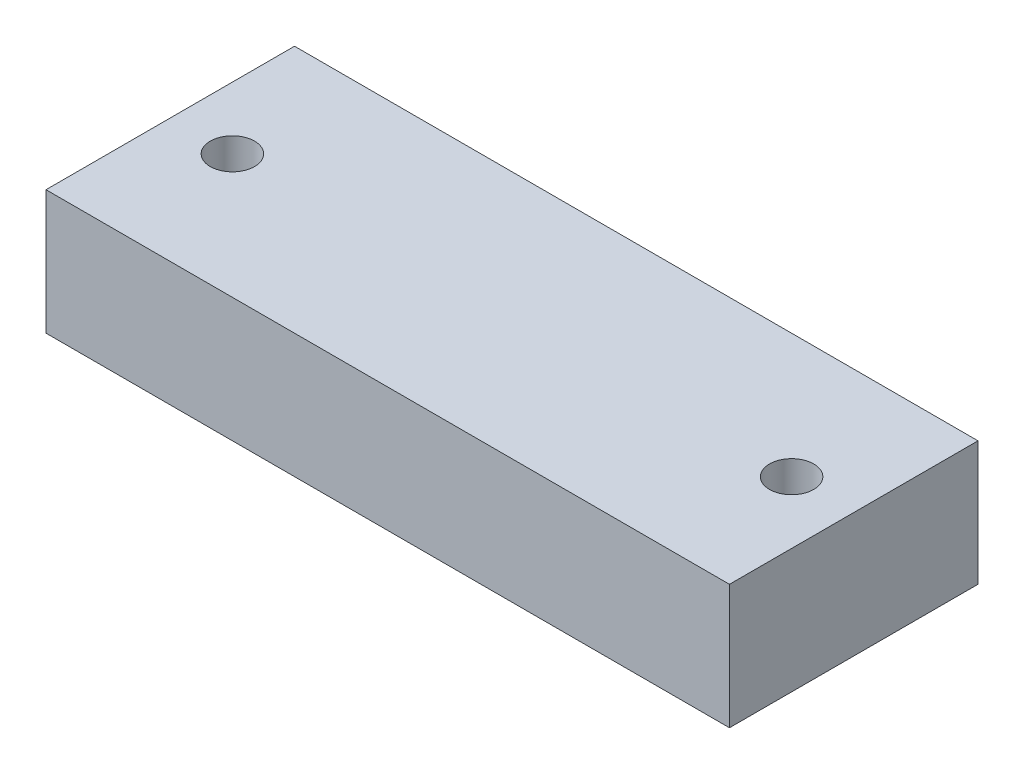
ISO-10303-21;
HEADER;
FILE_DESCRIPTION(('STEP AP214'),'2;1');
FILE_NAME('part.step','',(''),(''),'','','');
FILE_SCHEMA(('AUTOMOTIVE_DESIGN { 1 0 10303 214 1 1 1 1 }'));
ENDSEC;
DATA;
#1=APPLICATION_CONTEXT('core data for automotive mechanical design processes');
#2=APPLICATION_PROTOCOL_DEFINITION('international standard','automotive_design',2000,#1);
#3=PRODUCT_CONTEXT('',#1,'mechanical');
#4=PRODUCT('Part','Part','',(#3));
#5=PRODUCT_RELATED_PRODUCT_CATEGORY('part','',(#4));
#6=PRODUCT_DEFINITION_FORMATION('','',#4);
#7=PRODUCT_DEFINITION_CONTEXT('part definition',#1,'design');
#8=PRODUCT_DEFINITION('design','',#6,#7);
#9=PRODUCT_DEFINITION_SHAPE('','',#8);
#10=(LENGTH_UNIT() NAMED_UNIT(*) SI_UNIT(.MILLI.,.METRE.));
#11=(NAMED_UNIT(*) PLANE_ANGLE_UNIT() SI_UNIT($,.RADIAN.));
#12=(NAMED_UNIT(*) SI_UNIT($,.STERADIAN.) SOLID_ANGLE_UNIT());
#13=UNCERTAINTY_MEASURE_WITH_UNIT(LENGTH_MEASURE(1.E-05),#10,'distance_accuracy_value','');
#14=(GEOMETRIC_REPRESENTATION_CONTEXT(3) GLOBAL_UNCERTAINTY_ASSIGNED_CONTEXT((#13)) GLOBAL_UNIT_ASSIGNED_CONTEXT((#10,
#11,#12)) REPRESENTATION_CONTEXT('',''));
#15=CARTESIAN_POINT('',(0.,0.,0.));
#16=DIRECTION('',(0.,0.,1.));
#17=DIRECTION('',(1.,0.,0.));
#18=AXIS2_PLACEMENT_3D('',#15,#16,#17);
#19=CARTESIAN_POINT('',(17.4625,6.35,-6.35));
#20=DIRECTION('',(-1.,0.,0.));
#21=DIRECTION('',(0.,0.,1.));
#22=AXIS2_PLACEMENT_3D('',#19,#20,#21);
#23=PLANE('',#22);
#24=DIRECTION('',(0.,0.,-1.));
#25=VECTOR('',#24,1.);
#26=CARTESIAN_POINT('',(17.4625,0.,-6.35));
#27=LINE('',#26,#25);
#28=CARTESIAN_POINT('',(17.4625,0.,6.35));
#29=VERTEX_POINT('',#28);
#30=CARTESIAN_POINT('',(17.4625,0.,-6.35));
#31=VERTEX_POINT('',#30);
#32=EDGE_CURVE('E109',#29,#31,#27,.T.);
#33=ORIENTED_EDGE('',*,*,#32,.T.);
#34=DIRECTION('',(0.,-1.,0.));
#35=VECTOR('',#34,1.);
#36=CARTESIAN_POINT('',(17.4625,6.35,-6.35));
#37=LINE('',#36,#35);
#38=CARTESIAN_POINT('',(17.4625,6.35,-6.35));
#39=VERTEX_POINT('',#38);
#40=EDGE_CURVE('E11',#39,#31,#37,.T.);
#41=ORIENTED_EDGE('',*,*,#40,.F.);
#42=DIRECTION('',(0.,0.,-1.));
#43=VECTOR('',#42,1.);
#44=CARTESIAN_POINT('',(17.4625,6.35,-6.35));
#45=LINE('',#44,#43);
#46=CARTESIAN_POINT('',(17.4625,6.35,6.35));
#47=VERTEX_POINT('',#46);
#48=EDGE_CURVE('E93',#47,#39,#45,.T.);
#49=ORIENTED_EDGE('',*,*,#48,.F.);
#50=DIRECTION('',(0.,-1.,0.));
#51=VECTOR('',#50,1.);
#52=CARTESIAN_POINT('',(17.4625,6.35,6.35));
#53=LINE('',#52,#51);
#54=EDGE_CURVE('E105',#47,#29,#53,.T.);
#55=ORIENTED_EDGE('',*,*,#54,.T.);
#56=EDGE_LOOP('',(#33,#41,#49,#55));
#57=FACE_BOUND('',#56,.T.);
#58=ADVANCED_FACE('F41',(#57),#23,.F.);
#59=CARTESIAN_POINT('',(-17.4625,6.35,-6.35));
#60=DIRECTION('',(0.,0.,1.));
#61=DIRECTION('',(1.,0.,0.));
#62=AXIS2_PLACEMENT_3D('',#59,#60,#61);
#63=PLANE('',#62);
#64=DIRECTION('',(-1.,0.,0.));
#65=VECTOR('',#64,1.);
#66=CARTESIAN_POINT('',(-17.4625,0.,-6.35));
#67=LINE('',#66,#65);
#68=CARTESIAN_POINT('',(-17.4625,0.,-6.35));
#69=VERTEX_POINT('',#68);
#70=EDGE_CURVE('E98',#31,#69,#67,.T.);
#71=ORIENTED_EDGE('',*,*,#70,.T.);
#72=DIRECTION('',(0.,-1.,0.));
#73=VECTOR('',#72,1.);
#74=CARTESIAN_POINT('',(-17.4625,6.35,-6.35));
#75=LINE('',#74,#73);
#76=CARTESIAN_POINT('',(-17.4625,6.35,-6.35));
#77=VERTEX_POINT('',#76);
#78=EDGE_CURVE('E50',#77,#69,#75,.T.);
#79=ORIENTED_EDGE('',*,*,#78,.F.);
#80=DIRECTION('',(-1.,0.,0.));
#81=VECTOR('',#80,1.);
#82=CARTESIAN_POINT('',(-17.4625,6.35,-6.35));
#83=LINE('',#82,#81);
#84=EDGE_CURVE('E88',#39,#77,#83,.T.);
#85=ORIENTED_EDGE('',*,*,#84,.F.);
#86=ORIENTED_EDGE('',*,*,#40,.T.);
#87=EDGE_LOOP('',(#71,#79,#85,#86));
#88=FACE_BOUND('',#87,.T.);
#89=ADVANCED_FACE('F97',(#88),#63,.F.);
#90=CARTESIAN_POINT('',(-17.4625,6.35,-6.35));
#91=DIRECTION('',(1.,0.,0.));
#92=DIRECTION('',(0.,0.,-1.));
#93=AXIS2_PLACEMENT_3D('',#90,#91,#92);
#94=PLANE('',#93);
#95=DIRECTION('',(0.,0.,1.));
#96=VECTOR('',#95,1.);
#97=CARTESIAN_POINT('',(-17.4625,0.,-6.35));
#98=LINE('',#97,#96);
#99=CARTESIAN_POINT('',(-17.4625,0.,6.35));
#100=VERTEX_POINT('',#99);
#101=EDGE_CURVE('E75',#69,#100,#98,.T.);
#102=ORIENTED_EDGE('',*,*,#101,.T.);
#103=DIRECTION('',(0.,-1.,0.));
#104=VECTOR('',#103,1.);
#105=CARTESIAN_POINT('',(-17.4625,6.35,6.35));
#106=LINE('',#105,#104);
#107=CARTESIAN_POINT('',(-17.4625,6.35,6.35));
#108=VERTEX_POINT('',#107);
#109=EDGE_CURVE('E100',#108,#100,#106,.T.);
#110=ORIENTED_EDGE('',*,*,#109,.F.);
#111=DIRECTION('',(0.,0.,1.));
#112=VECTOR('',#111,1.);
#113=CARTESIAN_POINT('',(-17.4625,6.35,-6.35));
#114=LINE('',#113,#112);
#115=EDGE_CURVE('E91',#77,#108,#114,.T.);
#116=ORIENTED_EDGE('',*,*,#115,.F.);
#117=ORIENTED_EDGE('',*,*,#78,.T.);
#118=EDGE_LOOP('',(#102,#110,#116,#117));
#119=FACE_BOUND('',#118,.T.);
#120=ADVANCED_FACE('F101',(#119),#94,.F.);
#121=CARTESIAN_POINT('',(-17.4625,6.35,6.35));
#122=DIRECTION('',(0.,0.,-1.));
#123=DIRECTION('',(-1.,0.,0.));
#124=AXIS2_PLACEMENT_3D('',#121,#122,#123);
#125=PLANE('',#124);
#126=DIRECTION('',(1.,0.,0.));
#127=VECTOR('',#126,1.);
#128=CARTESIAN_POINT('',(-17.4625,0.,6.35));
#129=LINE('',#128,#127);
#130=EDGE_CURVE('E81',#100,#29,#129,.T.);
#131=ORIENTED_EDGE('',*,*,#130,.T.);
#132=ORIENTED_EDGE('',*,*,#54,.F.);
#133=DIRECTION('',(1.,0.,0.));
#134=VECTOR('',#133,1.);
#135=CARTESIAN_POINT('',(-17.4625,6.35,6.35));
#136=LINE('',#135,#134);
#137=EDGE_CURVE('E58',#108,#47,#136,.T.);
#138=ORIENTED_EDGE('',*,*,#137,.F.);
#139=ORIENTED_EDGE('',*,*,#109,.T.);
#140=EDGE_LOOP('',(#131,#132,#138,#139));
#141=FACE_BOUND('',#140,.T.);
#142=ADVANCED_FACE('F123',(#141),#125,.F.);
#143=CARTESIAN_POINT('',(0.,6.35,0.));
#144=DIRECTION('',(0.,1.,0.));
#145=DIRECTION('',(0.,0.,1.));
#146=AXIS2_PLACEMENT_3D('',#143,#144,#145);
#147=PLANE('',#146);
#148=CARTESIAN_POINT('',(-14.2875000000001,6.35,1.11022302462516E-13));
#149=DIRECTION('',(0.,1.,0.));
#150=DIRECTION('',(0.,0.,1.));
#151=AXIS2_PLACEMENT_3D('',#148,#149,#150);
#152=CIRCLE('',#151,1.13029999999999);
#153=CARTESIAN_POINT('',(-14.2875000000001,6.35,1.1303000000001));
#154=VERTEX_POINT('',#153);
#155=EDGE_CURVE('E141',#154,#154,#152,.T.);
#156=ORIENTED_EDGE('',*,*,#155,.F.);
#157=EDGE_LOOP('',(#156));
#158=FACE_BOUND('',#157,.T.);
#159=CARTESIAN_POINT('',(14.2874999999999,6.35,3.05311331771918E-13));
#160=DIRECTION('',(0.,1.,0.));
#161=DIRECTION('',(0.,0.,1.));
#162=AXIS2_PLACEMENT_3D('',#159,#160,#161);
#163=CIRCLE('',#162,1.13029999999999);
#164=CARTESIAN_POINT('',(14.2874999999999,6.35,1.13030000000029));
#165=VERTEX_POINT('',#164);
#166=EDGE_CURVE('E133',#165,#165,#163,.T.);
#167=ORIENTED_EDGE('',*,*,#166,.F.);
#168=EDGE_LOOP('',(#167));
#169=FACE_BOUND('',#168,.T.);
#170=ORIENTED_EDGE('',*,*,#48,.T.);
#171=ORIENTED_EDGE('',*,*,#84,.T.);
#172=ORIENTED_EDGE('',*,*,#115,.T.);
#173=ORIENTED_EDGE('',*,*,#137,.T.);
#174=EDGE_LOOP('',(#170,#171,#172,#173));
#175=FACE_BOUND('',#174,.T.);
#176=ADVANCED_FACE('F89',(#158,#169,#175),#147,.T.);
#177=CARTESIAN_POINT('',(0.,0.,0.));
#178=DIRECTION('',(0.,1.,0.));
#179=DIRECTION('',(0.,0.,1.));
#180=AXIS2_PLACEMENT_3D('',#177,#178,#179);
#181=PLANE('',#180);
#182=CARTESIAN_POINT('',(-14.2875000000001,0.,1.11022302462516E-13));
#183=DIRECTION('',(0.,1.,0.));
#184=DIRECTION('',(0.,0.,1.));
#185=AXIS2_PLACEMENT_3D('',#182,#183,#184);
#186=CIRCLE('',#185,1.13029999999999);
#187=CARTESIAN_POINT('',(-14.2875000000001,0.,1.1303000000001));
#188=VERTEX_POINT('',#187);
#189=EDGE_CURVE('E137',#188,#188,#186,.T.);
#190=ORIENTED_EDGE('',*,*,#189,.T.);
#191=EDGE_LOOP('',(#190));
#192=FACE_BOUND('',#191,.T.);
#193=CARTESIAN_POINT('',(14.2874999999999,0.,3.05311331771918E-13));
#194=DIRECTION('',(0.,1.,0.));
#195=DIRECTION('',(0.,0.,1.));
#196=AXIS2_PLACEMENT_3D('',#193,#194,#195);
#197=CIRCLE('',#196,1.13029999999999);
#198=CARTESIAN_POINT('',(14.2874999999999,0.,1.13030000000029));
#199=VERTEX_POINT('',#198);
#200=EDGE_CURVE('E113',#199,#199,#197,.T.);
#201=ORIENTED_EDGE('',*,*,#200,.T.);
#202=EDGE_LOOP('',(#201));
#203=FACE_BOUND('',#202,.T.);
#204=ORIENTED_EDGE('',*,*,#32,.F.);
#205=ORIENTED_EDGE('',*,*,#130,.F.);
#206=ORIENTED_EDGE('',*,*,#101,.F.);
#207=ORIENTED_EDGE('',*,*,#70,.F.);
#208=EDGE_LOOP('',(#204,#205,#206,#207));
#209=FACE_BOUND('',#208,.T.);
#210=ADVANCED_FACE('F126',(#192,#203,#209),#181,.F.);
#211=CARTESIAN_POINT('',(14.2874999999999,6.35,3.05311331771918E-13));
#212=DIRECTION('',(0.,1.,0.));
#213=DIRECTION('',(0.,0.,1.));
#214=AXIS2_PLACEMENT_3D('',#211,#212,#213);
#215=CYLINDRICAL_SURFACE('',#214,1.13029999999999);
#216=ORIENTED_EDGE('',*,*,#200,.F.);
#217=EDGE_LOOP('',(#216));
#218=FACE_BOUND('',#217,.T.);
#219=ORIENTED_EDGE('',*,*,#166,.T.);
#220=EDGE_LOOP('',(#219));
#221=FACE_BOUND('',#220,.T.);
#222=ADVANCED_FACE('F153',(#218,#221),#215,.F.);
#223=CARTESIAN_POINT('',(-14.2875000000001,6.35,1.11022302462516E-13));
#224=DIRECTION('',(0.,1.,0.));
#225=DIRECTION('',(0.,0.,1.));
#226=AXIS2_PLACEMENT_3D('',#223,#224,#225);
#227=CYLINDRICAL_SURFACE('',#226,1.13029999999999);
#228=ORIENTED_EDGE('',*,*,#189,.F.);
#229=EDGE_LOOP('',(#228));
#230=FACE_BOUND('',#229,.T.);
#231=ORIENTED_EDGE('',*,*,#155,.T.);
#232=EDGE_LOOP('',(#231));
#233=FACE_BOUND('',#232,.T.);
#234=ADVANCED_FACE('F146',(#230,#233),#227,.F.);
#235=CLOSED_SHELL('',(#58,#89,#120,#142,#176,#210,#222,#234));
#236=MANIFOLD_SOLID_BREP('B2',#235);
#237=ADVANCED_BREP_SHAPE_REPRESENTATION('',(#18,#236),#14);
#238=SHAPE_DEFINITION_REPRESENTATION(#9,#237);
ENDSEC;
END-ISO-10303-21;
